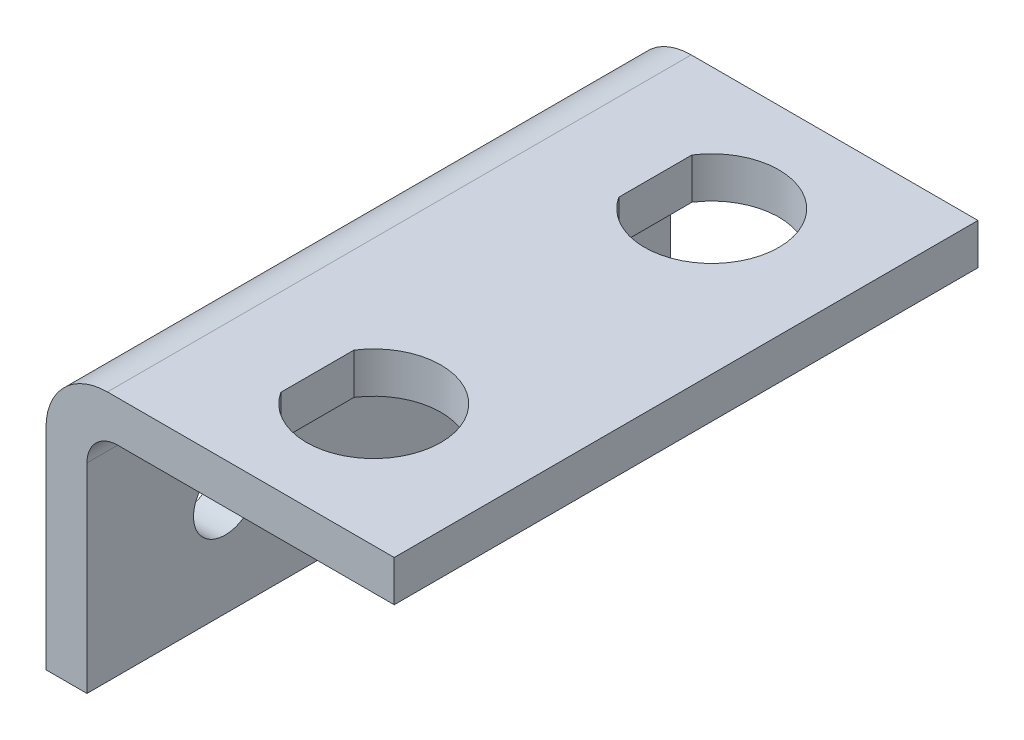
ISO-10303-21;
HEADER;
FILE_DESCRIPTION(('STEP AP214'),'2;1');
FILE_NAME('part.step','',(''),(''),'','','');
FILE_SCHEMA(('AUTOMOTIVE_DESIGN { 1 0 10303 214 1 1 1 1 }'));
ENDSEC;
DATA;
#1=APPLICATION_CONTEXT('core data for automotive mechanical design processes');
#2=APPLICATION_PROTOCOL_DEFINITION('international standard','automotive_design',2000,#1);
#3=PRODUCT_CONTEXT('',#1,'mechanical');
#4=PRODUCT('Part','Part','',(#3));
#5=PRODUCT_RELATED_PRODUCT_CATEGORY('part','',(#4));
#6=PRODUCT_DEFINITION_FORMATION('','',#4);
#7=PRODUCT_DEFINITION_CONTEXT('part definition',#1,'design');
#8=PRODUCT_DEFINITION('design','',#6,#7);
#9=PRODUCT_DEFINITION_SHAPE('','',#8);
#10=(LENGTH_UNIT() NAMED_UNIT(*) SI_UNIT(.MILLI.,.METRE.));
#11=(NAMED_UNIT(*) PLANE_ANGLE_UNIT() SI_UNIT($,.RADIAN.));
#12=(NAMED_UNIT(*) SI_UNIT($,.STERADIAN.) SOLID_ANGLE_UNIT());
#13=UNCERTAINTY_MEASURE_WITH_UNIT(LENGTH_MEASURE(1.E-05),#10,'distance_accuracy_value','');
#14=(GEOMETRIC_REPRESENTATION_CONTEXT(3) GLOBAL_UNCERTAINTY_ASSIGNED_CONTEXT((#13)) GLOBAL_UNIT_ASSIGNED_CONTEXT((#10,
#11,#12)) REPRESENTATION_CONTEXT('',''));
#15=CARTESIAN_POINT('',(0.,0.,0.));
#16=DIRECTION('',(0.,0.,1.));
#17=DIRECTION('',(1.,0.,0.));
#18=AXIS2_PLACEMENT_3D('',#15,#16,#17);
#19=CARTESIAN_POINT('',(-1.,0.,-14.25));
#20=DIRECTION('',(-1.,0.,0.));
#21=DIRECTION('',(0.,0.,1.));
#22=AXIS2_PLACEMENT_3D('',#19,#20,#21);
#23=PLANE('',#22);
#24=CARTESIAN_POINT('',(-1.,2.875,-7.5));
#25=DIRECTION('',(-1.,0.,0.));
#26=DIRECTION('',(0.,0.,1.));
#27=AXIS2_PLACEMENT_3D('',#24,#25,#26);
#28=CIRCLE('',#27,1.55);
#29=CARTESIAN_POINT('',(-1.,2.875,-5.95));
#30=VERTEX_POINT('',#29);
#31=EDGE_CURVE('E295',#30,#30,#28,.F.);
#32=ORIENTED_EDGE('',*,*,#31,.T.);
#33=EDGE_LOOP('',(#32));
#34=FACE_BOUND('',#33,.T.);
#35=CARTESIAN_POINT('',(-1.,2.875,7.5));
#36=DIRECTION('',(-1.,0.,0.));
#37=DIRECTION('',(0.,0.,1.));
#38=AXIS2_PLACEMENT_3D('',#35,#36,#37);
#39=CIRCLE('',#38,1.55);
#40=CARTESIAN_POINT('',(-1.,2.875,9.05));
#41=VERTEX_POINT('',#40);
#42=EDGE_CURVE('E139',#41,#41,#39,.F.);
#43=ORIENTED_EDGE('',*,*,#42,.T.);
#44=EDGE_LOOP('',(#43));
#45=FACE_BOUND('',#44,.T.);
#46=DIRECTION('',(0.,0.,1.));
#47=VECTOR('',#46,1.);
#48=CARTESIAN_POINT('',(-1.,-2.,-14.25));
#49=LINE('',#48,#47);
#50=CARTESIAN_POINT('',(-1.,-2.,-14.25));
#51=VERTEX_POINT('',#50);
#52=CARTESIAN_POINT('',(-1.,-2.,14.25));
#53=VERTEX_POINT('',#52);
#54=EDGE_CURVE('E36',#51,#53,#49,.T.);
#55=ORIENTED_EDGE('',*,*,#54,.T.);
#56=DIRECTION('',(0.,-1.,0.));
#57=VECTOR('',#56,1.);
#58=CARTESIAN_POINT('',(-1.,0.,14.25));
#59=LINE('',#58,#57);
#60=CARTESIAN_POINT('',(-1.,8.25,14.25));
#61=VERTEX_POINT('',#60);
#62=EDGE_CURVE('E160',#61,#53,#59,.T.);
#63=ORIENTED_EDGE('',*,*,#62,.F.);
#64=DIRECTION('',(0.,0.,1.));
#65=VECTOR('',#64,1.);
#66=CARTESIAN_POINT('',(-1.,8.25,-14.25));
#67=LINE('',#66,#65);
#68=CARTESIAN_POINT('',(-1.,8.25,-14.25));
#69=VERTEX_POINT('',#68);
#70=EDGE_CURVE('E11',#69,#61,#67,.T.);
#71=ORIENTED_EDGE('',*,*,#70,.F.);
#72=DIRECTION('',(0.,-1.,0.));
#73=VECTOR('',#72,1.);
#74=CARTESIAN_POINT('',(-1.,0.,-14.25));
#75=LINE('',#74,#73);
#76=EDGE_CURVE('E184',#69,#51,#75,.T.);
#77=ORIENTED_EDGE('',*,*,#76,.T.);
#78=EDGE_LOOP('',(#55,#63,#71,#77));
#79=FACE_BOUND('',#78,.T.);
#80=ADVANCED_FACE('F32',(#34,#45,#79),#23,.T.);
#81=CARTESIAN_POINT('',(2.,8.25,-14.25));
#82=DIRECTION('',(0.,0.,1.));
#83=DIRECTION('',(1.,0.,0.));
#84=AXIS2_PLACEMENT_3D('',#81,#82,#83);
#85=CYLINDRICAL_SURFACE('',#84,3.);
#86=ORIENTED_EDGE('',*,*,#70,.T.);
#87=CARTESIAN_POINT('',(2.,8.25,14.25));
#88=DIRECTION('',(0.,0.,1.));
#89=DIRECTION('',(1.,0.,0.));
#90=AXIS2_PLACEMENT_3D('',#87,#88,#89);
#91=CIRCLE('',#90,3.);
#92=CARTESIAN_POINT('',(2.,11.25,14.25));
#93=VERTEX_POINT('',#92);
#94=EDGE_CURVE('E181',#93,#61,#91,.T.);
#95=ORIENTED_EDGE('',*,*,#94,.F.);
#96=DIRECTION('',(0.,0.,1.));
#97=VECTOR('',#96,1.);
#98=CARTESIAN_POINT('',(2.,11.25,-14.25));
#99=LINE('',#98,#97);
#100=CARTESIAN_POINT('',(2.,11.25,-14.25));
#101=VERTEX_POINT('',#100);
#102=EDGE_CURVE('E41',#101,#93,#99,.T.);
#103=ORIENTED_EDGE('',*,*,#102,.F.);
#104=CARTESIAN_POINT('',(2.,8.25,-14.25));
#105=DIRECTION('',(0.,0.,1.));
#106=DIRECTION('',(1.,0.,0.));
#107=AXIS2_PLACEMENT_3D('',#104,#105,#106);
#108=CIRCLE('',#107,3.);
#109=EDGE_CURVE('E202',#101,#69,#108,.T.);
#110=ORIENTED_EDGE('',*,*,#109,.T.);
#111=EDGE_LOOP('',(#86,#95,#103,#110));
#112=FACE_BOUND('',#111,.T.);
#113=ADVANCED_FACE('F227',(#112),#85,.T.);
#114=CARTESIAN_POINT('',(14.,11.25,-14.25));
#115=DIRECTION('',(0.,1.,0.));
#116=DIRECTION('',(-1.,0.,0.));
#117=AXIS2_PLACEMENT_3D('',#114,#115,#116);
#118=PLANE('',#117);
#119=CARTESIAN_POINT('',(9.,11.25,-8.25));
#120=DIRECTION('',(0.,1.,0.));
#121=DIRECTION('',(0.,0.,-1.));
#122=AXIS2_PLACEMENT_3D('',#119,#120,#121);
#123=CIRCLE('',#122,3.28);
#124=CARTESIAN_POINT('',(6.24824147134964,11.25,-6.465));
#125=VERTEX_POINT('',#124);
#126=CARTESIAN_POINT('',(6.24824147134964,11.25,-10.035));
#127=VERTEX_POINT('',#126);
#128=EDGE_CURVE('E49',#125,#127,#123,.T.);
#129=ORIENTED_EDGE('',*,*,#128,.F.);
#130=DIRECTION('',(0.,0.,1.));
#131=VECTOR('',#130,1.);
#132=CARTESIAN_POINT('',(6.24824147134964,11.25,-6.465));
#133=LINE('',#132,#131);
#134=EDGE_CURVE('E131',#127,#125,#133,.T.);
#135=ORIENTED_EDGE('',*,*,#134,.F.);
#136=EDGE_LOOP('',(#129,#135));
#137=FACE_BOUND('',#136,.T.);
#138=CARTESIAN_POINT('',(9.,11.25,8.25));
#139=DIRECTION('',(0.,1.,0.));
#140=DIRECTION('',(0.,0.,-1.));
#141=AXIS2_PLACEMENT_3D('',#138,#139,#140);
#142=CIRCLE('',#141,3.28);
#143=CARTESIAN_POINT('',(6.24824147134964,11.25,10.035));
#144=VERTEX_POINT('',#143);
#145=CARTESIAN_POINT('',(6.24824147134964,11.25,6.465));
#146=VERTEX_POINT('',#145);
#147=EDGE_CURVE('E147',#144,#146,#142,.T.);
#148=ORIENTED_EDGE('',*,*,#147,.F.);
#149=DIRECTION('',(0.,0.,1.));
#150=VECTOR('',#149,1.);
#151=CARTESIAN_POINT('',(6.24824147134964,11.25,10.035));
#152=LINE('',#151,#150);
#153=EDGE_CURVE('E149',#146,#144,#152,.T.);
#154=ORIENTED_EDGE('',*,*,#153,.F.);
#155=EDGE_LOOP('',(#148,#154));
#156=FACE_BOUND('',#155,.T.);
#157=ORIENTED_EDGE('',*,*,#102,.T.);
#158=DIRECTION('',(-1.,0.,0.));
#159=VECTOR('',#158,1.);
#160=CARTESIAN_POINT('',(14.,11.25,14.25));
#161=LINE('',#160,#159);
#162=CARTESIAN_POINT('',(16.,11.25,14.25));
#163=VERTEX_POINT('',#162);
#164=EDGE_CURVE('E178',#163,#93,#161,.T.);
#165=ORIENTED_EDGE('',*,*,#164,.F.);
#166=DIRECTION('',(0.,0.,1.));
#167=VECTOR('',#166,1.);
#168=CARTESIAN_POINT('',(16.,11.25,-14.25));
#169=LINE('',#168,#167);
#170=CARTESIAN_POINT('',(16.,11.25,-14.25));
#171=VERTEX_POINT('',#170);
#172=EDGE_CURVE('E206',#171,#163,#169,.T.);
#173=ORIENTED_EDGE('',*,*,#172,.F.);
#174=DIRECTION('',(-1.,0.,0.));
#175=VECTOR('',#174,1.);
#176=CARTESIAN_POINT('',(14.,11.25,-14.25));
#177=LINE('',#176,#175);
#178=EDGE_CURVE('E200',#171,#101,#177,.T.);
#179=ORIENTED_EDGE('',*,*,#178,.T.);
#180=EDGE_LOOP('',(#157,#165,#173,#179));
#181=FACE_BOUND('',#180,.T.);
#182=ADVANCED_FACE('F249',(#137,#156,#181),#118,.T.);
#183=CARTESIAN_POINT('',(16.,11.25,-14.25));
#184=DIRECTION('',(1.,0.,0.));
#185=DIRECTION('',(0.,0.,-1.));
#186=AXIS2_PLACEMENT_3D('',#183,#184,#185);
#187=PLANE('',#186);
#188=ORIENTED_EDGE('',*,*,#172,.T.);
#189=DIRECTION('',(0.,1.,0.));
#190=VECTOR('',#189,1.);
#191=CARTESIAN_POINT('',(16.,11.25,14.25));
#192=LINE('',#191,#190);
#193=CARTESIAN_POINT('',(16.,9.25,14.25));
#194=VERTEX_POINT('',#193);
#195=EDGE_CURVE('E175',#194,#163,#192,.T.);
#196=ORIENTED_EDGE('',*,*,#195,.F.);
#197=DIRECTION('',(0.,0.,1.));
#198=VECTOR('',#197,1.);
#199=CARTESIAN_POINT('',(16.,9.25,-14.25));
#200=LINE('',#199,#198);
#201=CARTESIAN_POINT('',(16.,9.25,-14.25));
#202=VERTEX_POINT('',#201);
#203=EDGE_CURVE('E208',#202,#194,#200,.T.);
#204=ORIENTED_EDGE('',*,*,#203,.F.);
#205=DIRECTION('',(0.,1.,0.));
#206=VECTOR('',#205,1.);
#207=CARTESIAN_POINT('',(16.,11.25,-14.25));
#208=LINE('',#207,#206);
#209=EDGE_CURVE('E197',#202,#171,#208,.T.);
#210=ORIENTED_EDGE('',*,*,#209,.T.);
#211=EDGE_LOOP('',(#188,#196,#204,#210));
#212=FACE_BOUND('',#211,.T.);
#213=ADVANCED_FACE('F247',(#212),#187,.T.);
#214=CARTESIAN_POINT('',(16.,9.25,-14.25));
#215=DIRECTION('',(0.,-1.,0.));
#216=DIRECTION('',(0.,0.,-1.));
#217=AXIS2_PLACEMENT_3D('',#214,#215,#216);
#218=PLANE('',#217);
#219=CARTESIAN_POINT('',(9.,9.25,-8.25));
#220=DIRECTION('',(0.,-1.,0.));
#221=DIRECTION('',(0.,0.,-1.));
#222=AXIS2_PLACEMENT_3D('',#219,#220,#221);
#223=CIRCLE('',#222,3.28);
#224=CARTESIAN_POINT('',(6.24824147134964,9.25,-6.465));
#225=VERTEX_POINT('',#224);
#226=CARTESIAN_POINT('',(6.24824147134964,9.25,-10.035));
#227=VERTEX_POINT('',#226);
#228=EDGE_CURVE('E130',#225,#227,#223,.F.);
#229=ORIENTED_EDGE('',*,*,#228,.T.);
#230=DIRECTION('',(0.,0.,1.));
#231=VECTOR('',#230,1.);
#232=CARTESIAN_POINT('',(6.24824147134964,9.25,-6.465));
#233=LINE('',#232,#231);
#234=EDGE_CURVE('E121',#227,#225,#233,.T.);
#235=ORIENTED_EDGE('',*,*,#234,.T.);
#236=EDGE_LOOP('',(#229,#235));
#237=FACE_BOUND('',#236,.T.);
#238=CARTESIAN_POINT('',(9.,9.25,8.25));
#239=DIRECTION('',(0.,-1.,0.));
#240=DIRECTION('',(0.,0.,-1.));
#241=AXIS2_PLACEMENT_3D('',#238,#239,#240);
#242=CIRCLE('',#241,3.28);
#243=CARTESIAN_POINT('',(6.24824147134964,9.25,10.035));
#244=VERTEX_POINT('',#243);
#245=CARTESIAN_POINT('',(6.24824147134964,9.25,6.465));
#246=VERTEX_POINT('',#245);
#247=EDGE_CURVE('E127',#244,#246,#242,.F.);
#248=ORIENTED_EDGE('',*,*,#247,.T.);
#249=DIRECTION('',(0.,0.,1.));
#250=VECTOR('',#249,1.);
#251=CARTESIAN_POINT('',(6.24824147134964,9.25,10.035));
#252=LINE('',#251,#250);
#253=EDGE_CURVE('E155',#246,#244,#252,.T.);
#254=ORIENTED_EDGE('',*,*,#253,.T.);
#255=EDGE_LOOP('',(#248,#254));
#256=FACE_BOUND('',#255,.T.);
#257=ORIENTED_EDGE('',*,*,#203,.T.);
#258=DIRECTION('',(1.,0.,0.));
#259=VECTOR('',#258,1.);
#260=CARTESIAN_POINT('',(2.5,9.25,14.25));
#261=LINE('',#260,#259);
#262=CARTESIAN_POINT('',(2.5,9.25,14.25));
#263=VERTEX_POINT('',#262);
#264=EDGE_CURVE('E172',#263,#194,#261,.T.);
#265=ORIENTED_EDGE('',*,*,#264,.F.);
#266=DIRECTION('',(0.,0.,1.));
#267=VECTOR('',#266,1.);
#268=CARTESIAN_POINT('',(2.5,9.25,-14.25));
#269=LINE('',#268,#267);
#270=CARTESIAN_POINT('',(2.5,9.25,-14.25));
#271=VERTEX_POINT('',#270);
#272=EDGE_CURVE('E210',#271,#263,#269,.T.);
#273=ORIENTED_EDGE('',*,*,#272,.F.);
#274=DIRECTION('',(1.,0.,0.));
#275=VECTOR('',#274,1.);
#276=CARTESIAN_POINT('',(2.5,9.25,-14.25));
#277=LINE('',#276,#275);
#278=EDGE_CURVE('E195',#271,#202,#277,.T.);
#279=ORIENTED_EDGE('',*,*,#278,.T.);
#280=EDGE_LOOP('',(#257,#265,#273,#279));
#281=FACE_BOUND('',#280,.T.);
#282=ADVANCED_FACE('F133',(#237,#256,#281),#218,.T.);
#283=CARTESIAN_POINT('',(2.5,7.75,-14.25));
#284=DIRECTION('',(0.,0.,1.));
#285=DIRECTION('',(1.,0.,0.));
#286=AXIS2_PLACEMENT_3D('',#283,#284,#285);
#287=CYLINDRICAL_SURFACE('',#286,1.5);
#288=ORIENTED_EDGE('',*,*,#272,.T.);
#289=CARTESIAN_POINT('',(2.5,7.75,14.25));
#290=DIRECTION('',(0.,0.,-1.));
#291=DIRECTION('',(1.,0.,0.));
#292=AXIS2_PLACEMENT_3D('',#289,#290,#291);
#293=CIRCLE('',#292,1.5);
#294=CARTESIAN_POINT('',(1.,7.75,14.25));
#295=VERTEX_POINT('',#294);
#296=EDGE_CURVE('E169',#295,#263,#293,.T.);
#297=ORIENTED_EDGE('',*,*,#296,.F.);
#298=DIRECTION('',(0.,0.,1.));
#299=VECTOR('',#298,1.);
#300=CARTESIAN_POINT('',(1.,7.75,-14.25));
#301=LINE('',#300,#299);
#302=CARTESIAN_POINT('',(1.,7.75,-14.25));
#303=VERTEX_POINT('',#302);
#304=EDGE_CURVE('E212',#303,#295,#301,.T.);
#305=ORIENTED_EDGE('',*,*,#304,.F.);
#306=CARTESIAN_POINT('',(2.5,7.75,-14.25));
#307=DIRECTION('',(0.,0.,-1.));
#308=DIRECTION('',(1.,0.,0.));
#309=AXIS2_PLACEMENT_3D('',#306,#307,#308);
#310=CIRCLE('',#309,1.5);
#311=EDGE_CURVE('E192',#303,#271,#310,.T.);
#312=ORIENTED_EDGE('',*,*,#311,.T.);
#313=EDGE_LOOP('',(#288,#297,#305,#312));
#314=FACE_BOUND('',#313,.T.);
#315=ADVANCED_FACE('F241',(#314),#287,.F.);
#316=CARTESIAN_POINT('',(1.,0.,-14.25));
#317=DIRECTION('',(1.,0.,0.));
#318=DIRECTION('',(0.,0.,-1.));
#319=AXIS2_PLACEMENT_3D('',#316,#317,#318);
#320=PLANE('',#319);
#321=CARTESIAN_POINT('',(1.,2.875,-7.5));
#322=DIRECTION('',(1.,0.,0.));
#323=DIRECTION('',(0.,0.,-1.));
#324=AXIS2_PLACEMENT_3D('',#321,#322,#323);
#325=CIRCLE('',#324,1.55);
#326=CARTESIAN_POINT('',(1.,2.875,-9.05));
#327=VERTEX_POINT('',#326);
#328=EDGE_CURVE('E298',#327,#327,#325,.T.);
#329=ORIENTED_EDGE('',*,*,#328,.F.);
#330=EDGE_LOOP('',(#329));
#331=FACE_BOUND('',#330,.T.);
#332=CARTESIAN_POINT('',(1.,2.875,7.5));
#333=DIRECTION('',(1.,0.,0.));
#334=DIRECTION('',(0.,0.,-1.));
#335=AXIS2_PLACEMENT_3D('',#332,#333,#334);
#336=CIRCLE('',#335,1.55);
#337=CARTESIAN_POINT('',(1.,2.875,5.95));
#338=VERTEX_POINT('',#337);
#339=EDGE_CURVE('E135',#338,#338,#336,.T.);
#340=ORIENTED_EDGE('',*,*,#339,.F.);
#341=EDGE_LOOP('',(#340));
#342=FACE_BOUND('',#341,.T.);
#343=ORIENTED_EDGE('',*,*,#304,.T.);
#344=DIRECTION('',(0.,1.,0.));
#345=VECTOR('',#344,1.);
#346=CARTESIAN_POINT('',(1.,-2.,14.25));
#347=LINE('',#346,#345);
#348=CARTESIAN_POINT('',(1.,-2.,14.25));
#349=VERTEX_POINT('',#348);
#350=EDGE_CURVE('E166',#349,#295,#347,.T.);
#351=ORIENTED_EDGE('',*,*,#350,.F.);
#352=DIRECTION('',(0.,0.,1.));
#353=VECTOR('',#352,1.);
#354=CARTESIAN_POINT('',(1.,-2.,-14.25));
#355=LINE('',#354,#353);
#356=CARTESIAN_POINT('',(1.,-2.,-14.25));
#357=VERTEX_POINT('',#356);
#358=EDGE_CURVE('E213',#357,#349,#355,.T.);
#359=ORIENTED_EDGE('',*,*,#358,.F.);
#360=DIRECTION('',(0.,1.,0.));
#361=VECTOR('',#360,1.);
#362=CARTESIAN_POINT('',(1.,-2.,-14.25));
#363=LINE('',#362,#361);
#364=EDGE_CURVE('E190',#357,#303,#363,.T.);
#365=ORIENTED_EDGE('',*,*,#364,.T.);
#366=EDGE_LOOP('',(#343,#351,#359,#365));
#367=FACE_BOUND('',#366,.T.);
#368=ADVANCED_FACE('F238',(#331,#342,#367),#320,.T.);
#369=CARTESIAN_POINT('',(-1.,-2.,-14.25));
#370=DIRECTION('',(0.,-1.,0.));
#371=DIRECTION('',(0.,0.,-1.));
#372=AXIS2_PLACEMENT_3D('',#369,#370,#371);
#373=PLANE('',#372);
#374=ORIENTED_EDGE('',*,*,#358,.T.);
#375=DIRECTION('',(1.,0.,0.));
#376=VECTOR('',#375,1.);
#377=CARTESIAN_POINT('',(-1.,-2.,14.25));
#378=LINE('',#377,#376);
#379=EDGE_CURVE('E163',#53,#349,#378,.T.);
#380=ORIENTED_EDGE('',*,*,#379,.F.);
#381=ORIENTED_EDGE('',*,*,#54,.F.);
#382=DIRECTION('',(1.,0.,0.));
#383=VECTOR('',#382,1.);
#384=CARTESIAN_POINT('',(-1.,-2.,-14.25));
#385=LINE('',#384,#383);
#386=EDGE_CURVE('E187',#51,#357,#385,.T.);
#387=ORIENTED_EDGE('',*,*,#386,.T.);
#388=EDGE_LOOP('',(#374,#380,#381,#387));
#389=FACE_BOUND('',#388,.T.);
#390=ADVANCED_FACE('F34',(#389),#373,.T.);
#391=CARTESIAN_POINT('',(2.5,7.75,-14.25));
#392=DIRECTION('',(0.,0.,1.));
#393=DIRECTION('',(1.,0.,0.));
#394=AXIS2_PLACEMENT_3D('',#391,#392,#393);
#395=PLANE('',#394);
#396=ORIENTED_EDGE('',*,*,#76,.F.);
#397=ORIENTED_EDGE('',*,*,#109,.F.);
#398=ORIENTED_EDGE('',*,*,#178,.F.);
#399=ORIENTED_EDGE('',*,*,#209,.F.);
#400=ORIENTED_EDGE('',*,*,#278,.F.);
#401=ORIENTED_EDGE('',*,*,#311,.F.);
#402=ORIENTED_EDGE('',*,*,#364,.F.);
#403=ORIENTED_EDGE('',*,*,#386,.F.);
#404=EDGE_LOOP('',(#396,#397,#398,#399,#400,#401,#402,#403));
#405=FACE_BOUND('',#404,.T.);
#406=ADVANCED_FACE('F231',(#405),#395,.F.);
#407=CARTESIAN_POINT('',(2.5,7.75,14.25));
#408=DIRECTION('',(0.,0.,1.));
#409=DIRECTION('',(1.,0.,0.));
#410=AXIS2_PLACEMENT_3D('',#407,#408,#409);
#411=PLANE('',#410);
#412=ORIENTED_EDGE('',*,*,#62,.T.);
#413=ORIENTED_EDGE('',*,*,#379,.T.);
#414=ORIENTED_EDGE('',*,*,#350,.T.);
#415=ORIENTED_EDGE('',*,*,#296,.T.);
#416=ORIENTED_EDGE('',*,*,#264,.T.);
#417=ORIENTED_EDGE('',*,*,#195,.T.);
#418=ORIENTED_EDGE('',*,*,#164,.T.);
#419=ORIENTED_EDGE('',*,*,#94,.T.);
#420=EDGE_LOOP('',(#412,#413,#414,#415,#416,#417,#418,#419));
#421=FACE_BOUND('',#420,.T.);
#422=ADVANCED_FACE('F222',(#421),#411,.T.);
#423=CARTESIAN_POINT('',(9.,-2.001,8.25));
#424=DIRECTION('',(0.,1.,0.));
#425=DIRECTION('',(0.,0.,1.));
#426=AXIS2_PLACEMENT_3D('',#423,#424,#425);
#427=CYLINDRICAL_SURFACE('',#426,3.28);
#428=DIRECTION('',(0.,1.,0.));
#429=VECTOR('',#428,1.);
#430=CARTESIAN_POINT('',(6.24824147134964,-2.001,10.035));
#431=LINE('',#430,#429);
#432=EDGE_CURVE('E153',#244,#144,#431,.T.);
#433=ORIENTED_EDGE('',*,*,#432,.T.);
#434=ORIENTED_EDGE('',*,*,#147,.T.);
#435=DIRECTION('',(0.,1.,0.));
#436=VECTOR('',#435,1.);
#437=CARTESIAN_POINT('',(6.24824147134964,-2.001,6.465));
#438=LINE('',#437,#436);
#439=EDGE_CURVE('E152',#246,#146,#438,.T.);
#440=ORIENTED_EDGE('',*,*,#439,.F.);
#441=ORIENTED_EDGE('',*,*,#247,.F.);
#442=EDGE_LOOP('',(#433,#434,#440,#441));
#443=FACE_BOUND('',#442,.T.);
#444=ADVANCED_FACE('F272',(#443),#427,.F.);
#445=CARTESIAN_POINT('',(6.24824147134964,-2.001,10.035));
#446=DIRECTION('',(-1.,0.,0.));
#447=DIRECTION('',(0.,0.,1.));
#448=AXIS2_PLACEMENT_3D('',#445,#446,#447);
#449=PLANE('',#448);
#450=ORIENTED_EDGE('',*,*,#439,.T.);
#451=ORIENTED_EDGE('',*,*,#153,.T.);
#452=ORIENTED_EDGE('',*,*,#432,.F.);
#453=ORIENTED_EDGE('',*,*,#253,.F.);
#454=EDGE_LOOP('',(#450,#451,#452,#453));
#455=FACE_BOUND('',#454,.T.);
#456=ADVANCED_FACE('F275',(#455),#449,.F.);
#457=CARTESIAN_POINT('',(9.,-2.001,-8.25));
#458=DIRECTION('',(0.,1.,0.));
#459=DIRECTION('',(0.,0.,1.));
#460=AXIS2_PLACEMENT_3D('',#457,#458,#459);
#461=CYLINDRICAL_SURFACE('',#460,3.28);
#462=DIRECTION('',(0.,1.,0.));
#463=VECTOR('',#462,1.);
#464=CARTESIAN_POINT('',(6.24824147134964,-2.001,-6.465));
#465=LINE('',#464,#463);
#466=EDGE_CURVE('E56',#225,#125,#465,.T.);
#467=ORIENTED_EDGE('',*,*,#466,.T.);
#468=ORIENTED_EDGE('',*,*,#128,.T.);
#469=DIRECTION('',(0.,1.,0.));
#470=VECTOR('',#469,1.);
#471=CARTESIAN_POINT('',(6.24824147134964,-2.001,-10.035));
#472=LINE('',#471,#470);
#473=EDGE_CURVE('E123',#227,#127,#472,.T.);
#474=ORIENTED_EDGE('',*,*,#473,.F.);
#475=ORIENTED_EDGE('',*,*,#228,.F.);
#476=EDGE_LOOP('',(#467,#468,#474,#475));
#477=FACE_BOUND('',#476,.T.);
#478=ADVANCED_FACE('F129',(#477),#461,.F.);
#479=CARTESIAN_POINT('',(6.24824147134964,-2.001,-6.465));
#480=DIRECTION('',(-1.,0.,0.));
#481=DIRECTION('',(0.,0.,1.));
#482=AXIS2_PLACEMENT_3D('',#479,#480,#481);
#483=PLANE('',#482);
#484=ORIENTED_EDGE('',*,*,#473,.T.);
#485=ORIENTED_EDGE('',*,*,#134,.T.);
#486=ORIENTED_EDGE('',*,*,#466,.F.);
#487=ORIENTED_EDGE('',*,*,#234,.F.);
#488=EDGE_LOOP('',(#484,#485,#486,#487));
#489=FACE_BOUND('',#488,.T.);
#490=ADVANCED_FACE('F122',(#489),#483,.F.);
#491=CARTESIAN_POINT('',(-1.001,2.875,7.5));
#492=DIRECTION('',(1.,0.,0.));
#493=DIRECTION('',(0.,0.,-1.));
#494=AXIS2_PLACEMENT_3D('',#491,#492,#493);
#495=CYLINDRICAL_SURFACE('',#494,1.55);
#496=ORIENTED_EDGE('',*,*,#42,.F.);
#497=EDGE_LOOP('',(#496));
#498=FACE_BOUND('',#497,.T.);
#499=ORIENTED_EDGE('',*,*,#339,.T.);
#500=EDGE_LOOP('',(#499));
#501=FACE_BOUND('',#500,.T.);
#502=ADVANCED_FACE('F284',(#498,#501),#495,.F.);
#503=CARTESIAN_POINT('',(-1.001,2.875,-7.5));
#504=DIRECTION('',(1.,0.,0.));
#505=DIRECTION('',(0.,0.,-1.));
#506=AXIS2_PLACEMENT_3D('',#503,#504,#505);
#507=CYLINDRICAL_SURFACE('',#506,1.55);
#508=ORIENTED_EDGE('',*,*,#31,.F.);
#509=EDGE_LOOP('',(#508));
#510=FACE_BOUND('',#509,.T.);
#511=ORIENTED_EDGE('',*,*,#328,.T.);
#512=EDGE_LOOP('',(#511));
#513=FACE_BOUND('',#512,.T.);
#514=ADVANCED_FACE('F287',(#510,#513),#507,.F.);
#515=CLOSED_SHELL('',(#80,#113,#182,#213,#282,#315,#368,#390,#406,#422,#444,#456,#478,#490,#502,#514));
#516=MANIFOLD_SOLID_BREP('B2',#515);
#517=ADVANCED_BREP_SHAPE_REPRESENTATION('',(#18,#516),#14);
#518=SHAPE_DEFINITION_REPRESENTATION(#9,#517);
ENDSEC;
END-ISO-10303-21;
